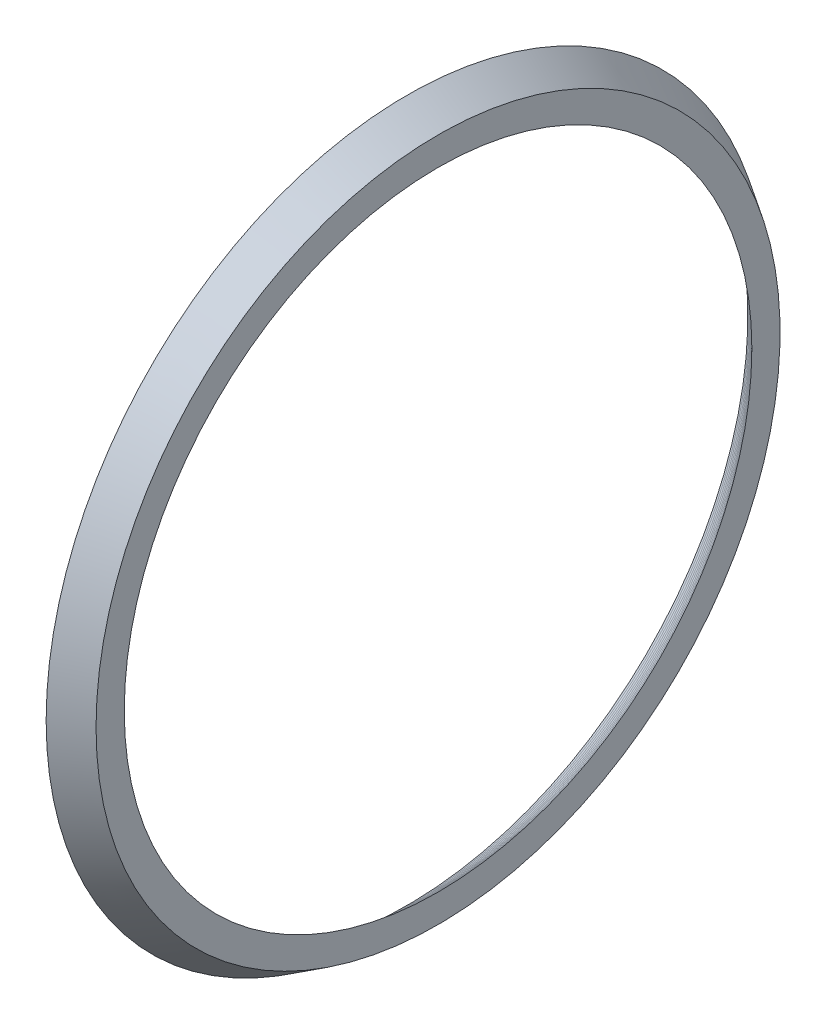
ISO-10303-21;
HEADER;
FILE_DESCRIPTION(('STEP AP214'),'2;1');
FILE_NAME('part.step','',(''),(''),'','','');
FILE_SCHEMA(('AUTOMOTIVE_DESIGN { 1 0 10303 214 1 1 1 1 }'));
ENDSEC;
DATA;
#1=APPLICATION_CONTEXT('core data for automotive mechanical design processes');
#2=APPLICATION_PROTOCOL_DEFINITION('international standard','automotive_design',2000,#1);
#3=PRODUCT_CONTEXT('',#1,'mechanical');
#4=PRODUCT('Part','Part','',(#3));
#5=PRODUCT_RELATED_PRODUCT_CATEGORY('part','',(#4));
#6=PRODUCT_DEFINITION_FORMATION('','',#4);
#7=PRODUCT_DEFINITION_CONTEXT('part definition',#1,'design');
#8=PRODUCT_DEFINITION('design','',#6,#7);
#9=PRODUCT_DEFINITION_SHAPE('','',#8);
#10=(LENGTH_UNIT() NAMED_UNIT(*) SI_UNIT(.MILLI.,.METRE.));
#11=(NAMED_UNIT(*) PLANE_ANGLE_UNIT() SI_UNIT($,.RADIAN.));
#12=(NAMED_UNIT(*) SI_UNIT($,.STERADIAN.) SOLID_ANGLE_UNIT());
#13=UNCERTAINTY_MEASURE_WITH_UNIT(LENGTH_MEASURE(1.E-05),#10,'distance_accuracy_value','');
#14=(GEOMETRIC_REPRESENTATION_CONTEXT(3) GLOBAL_UNCERTAINTY_ASSIGNED_CONTEXT((#13)) GLOBAL_UNIT_ASSIGNED_CONTEXT((#10,
#11,#12)) REPRESENTATION_CONTEXT('',''));
#15=CARTESIAN_POINT('',(0.,0.,0.));
#16=DIRECTION('',(0.,0.,1.));
#17=DIRECTION('',(1.,0.,0.));
#18=AXIS2_PLACEMENT_3D('',#15,#16,#17);
#19=CARTESIAN_POINT('',(3.175,70.5115,0.));
#20=DIRECTION('',(-1.,0.,0.));
#21=DIRECTION('',(0.,0.,1.));
#22=AXIS2_PLACEMENT_3D('',#19,#20,#21);
#23=PLANE('',#22);
#24=CARTESIAN_POINT('',(3.17499999999998,0.,0.));
#25=DIRECTION('',(-1.,0.,0.));
#26=DIRECTION('',(0.,0.,1.));
#27=AXIS2_PLACEMENT_3D('',#24,#25,#26);
#28=CIRCLE('',#27,70.5115);
#29=CARTESIAN_POINT('',(3.17499999999998,0.,70.5115));
#30=VERTEX_POINT('',#29);
#31=EDGE_CURVE('E10',#30,#30,#28,.T.);
#32=ORIENTED_EDGE('',*,*,#31,.F.);
#33=EDGE_LOOP('',(#32));
#34=FACE_BOUND('',#33,.T.);
#35=CARTESIAN_POINT('',(3.17499999999998,0.,0.));
#36=DIRECTION('',(-1.,0.,0.));
#37=DIRECTION('',(0.,0.,1.));
#38=AXIS2_PLACEMENT_3D('',#35,#36,#37);
#39=CIRCLE('',#38,64.6948926829307);
#40=CARTESIAN_POINT('',(3.17499999999998,0.,64.6948926829307));
#41=VERTEX_POINT('',#40);
#42=EDGE_CURVE('E77',#41,#41,#39,.T.);
#43=ORIENTED_EDGE('',*,*,#42,.T.);
#44=EDGE_LOOP('',(#43));
#45=FACE_BOUND('',#44,.T.);
#46=ADVANCED_FACE('F39',(#34,#45),#23,.F.);
#47=CARTESIAN_POINT('',(3.17499999999998,0.,0.));
#48=DIRECTION('',(-1.,0.,0.));
#49=DIRECTION('',(0.,0.,1.));
#50=AXIS2_PLACEMENT_3D('',#47,#48,#49);
#51=CONICAL_SURFACE('',#50,70.5115,0.55499572733859);
#52=CARTESIAN_POINT('',(-3.17499999999998,0.,0.));
#53=DIRECTION('',(-1.,0.,0.));
#54=DIRECTION('',(0.,0.,1.));
#55=AXIS2_PLACEMENT_3D('',#52,#53,#54);
#56=CIRCLE('',#55,74.4485);
#57=CARTESIAN_POINT('',(-3.17499999999998,0.,74.4485));
#58=VERTEX_POINT('',#57);
#59=EDGE_CURVE('E44',#58,#58,#56,.T.);
#60=ORIENTED_EDGE('',*,*,#59,.F.);
#61=EDGE_LOOP('',(#60));
#62=FACE_BOUND('',#61,.T.);
#63=ORIENTED_EDGE('',*,*,#31,.T.);
#64=EDGE_LOOP('',(#63));
#65=FACE_BOUND('',#64,.T.);
#66=ADVANCED_FACE('F132',(#62,#65),#51,.T.);
#67=CARTESIAN_POINT('',(-3.175,70.2326060841579,0.));
#68=DIRECTION('',(1.,0.,0.));
#69=DIRECTION('',(0.,0.,-1.));
#70=AXIS2_PLACEMENT_3D('',#67,#68,#69);
#71=PLANE('',#70);
#72=CARTESIAN_POINT('',(-3.17499999999998,0.,0.));
#73=DIRECTION('',(-1.,0.,0.));
#74=DIRECTION('',(0.,0.,1.));
#75=AXIS2_PLACEMENT_3D('',#72,#73,#74);
#76=CIRCLE('',#75,70.2326060841579);
#77=CARTESIAN_POINT('',(-3.17499999999998,0.,70.2326060841579));
#78=VERTEX_POINT('',#77);
#79=EDGE_CURVE('E47',#78,#78,#76,.T.);
#80=ORIENTED_EDGE('',*,*,#79,.F.);
#81=EDGE_LOOP('',(#80));
#82=FACE_BOUND('',#81,.T.);
#83=ORIENTED_EDGE('',*,*,#59,.T.);
#84=EDGE_LOOP('',(#83));
#85=FACE_BOUND('',#84,.T.);
#86=ADVANCED_FACE('F127',(#82,#85),#71,.F.);
#87=CARTESIAN_POINT('',(-3.17499999999998,0.,0.));
#88=DIRECTION('',(-1.,0.,0.));
#89=DIRECTION('',(0.,0.,1.));
#90=AXIS2_PLACEMENT_3D('',#87,#88,#89);
#91=CONICAL_SURFACE('',#90,70.2326060841579,0.640697177792621);
#92=CARTESIAN_POINT('',(-2.38125,0.,0.));
#93=DIRECTION('',(-1.,0.,0.));
#94=DIRECTION('',(0.,0.,1.));
#95=AXIS2_PLACEMENT_3D('',#92,#93,#94);
#96=CIRCLE('',#95,69.6407638271231);
#97=CARTESIAN_POINT('',(-2.38125,0.,69.6407638271231));
#98=VERTEX_POINT('',#97);
#99=EDGE_CURVE('E52',#98,#98,#96,.T.);
#100=ORIENTED_EDGE('',*,*,#99,.F.);
#101=EDGE_LOOP('',(#100));
#102=FACE_BOUND('',#101,.T.);
#103=ORIENTED_EDGE('',*,*,#79,.T.);
#104=EDGE_LOOP('',(#103));
#105=FACE_BOUND('',#104,.T.);
#106=ADVANCED_FACE('F118',(#102,#105),#91,.F.);
#107=CARTESIAN_POINT('',(-2.38125,0.,0.));
#108=DIRECTION('',(-1.,0.,0.));
#109=DIRECTION('',(0.,0.,1.));
#110=AXIS2_PLACEMENT_3D('',#107,#108,#109);
#111=CONICAL_SURFACE('',#110,69.6407638271231,0.662235364243934);
#112=CARTESIAN_POINT('',(-1.58750000000002,0.,0.));
#113=DIRECTION('',(-1.,0.,0.));
#114=DIRECTION('',(0.,0.,1.));
#115=AXIS2_PLACEMENT_3D('',#112,#113,#114);
#116=CIRCLE('',#115,69.0218825444318);
#117=CARTESIAN_POINT('',(-1.58750000000002,0.,69.0218825444318));
#118=VERTEX_POINT('',#117);
#119=EDGE_CURVE('E59',#118,#118,#116,.T.);
#120=ORIENTED_EDGE('',*,*,#119,.F.);
#121=EDGE_LOOP('',(#120));
#122=FACE_BOUND('',#121,.T.);
#123=ORIENTED_EDGE('',*,*,#99,.T.);
#124=EDGE_LOOP('',(#123));
#125=FACE_BOUND('',#124,.T.);
#126=ADVANCED_FACE('F111',(#122,#125),#111,.F.);
#127=CARTESIAN_POINT('',(-1.58750000000002,0.,0.));
#128=DIRECTION('',(-1.,0.,0.));
#129=DIRECTION('',(0.,0.,1.));
#130=AXIS2_PLACEMENT_3D('',#127,#128,#129);
#131=CONICAL_SURFACE('',#130,69.0218825444318,0.683630813781778);
#132=CARTESIAN_POINT('',(-0.793749999999982,0.,0.));
#133=DIRECTION('',(-1.,0.,0.));
#134=DIRECTION('',(0.,0.,1.));
#135=AXIS2_PLACEMENT_3D('',#132,#133,#134);
#136=CIRCLE('',#135,68.3752269537193);
#137=CARTESIAN_POINT('',(-0.793749999999982,0.,68.3752269537193));
#138=VERTEX_POINT('',#137);
#139=EDGE_CURVE('E62',#138,#138,#136,.T.);
#140=ORIENTED_EDGE('',*,*,#139,.F.);
#141=EDGE_LOOP('',(#140));
#142=FACE_BOUND('',#141,.T.);
#143=ORIENTED_EDGE('',*,*,#119,.T.);
#144=EDGE_LOOP('',(#143));
#145=FACE_BOUND('',#144,.T.);
#146=ADVANCED_FACE('F107',(#142,#145),#131,.F.);
#147=CARTESIAN_POINT('',(-0.793749999999982,0.,0.));
#148=DIRECTION('',(-1.,0.,0.));
#149=DIRECTION('',(0.,0.,1.));
#150=AXIS2_PLACEMENT_3D('',#147,#148,#149);
#151=CONICAL_SURFACE('',#150,68.3752269537193,0.704888490276885);
#152=CARTESIAN_POINT('',(0.,0.,0.));
#153=DIRECTION('',(-1.,0.,0.));
#154=DIRECTION('',(0.,0.,1.));
#155=AXIS2_PLACEMENT_3D('',#152,#153,#154);
#156=CIRCLE('',#155,67.7);
#157=CARTESIAN_POINT('',(0.,0.,67.7));
#158=VERTEX_POINT('',#157);
#159=EDGE_CURVE('E61',#158,#158,#156,.T.);
#160=ORIENTED_EDGE('',*,*,#159,.F.);
#161=EDGE_LOOP('',(#160));
#162=FACE_BOUND('',#161,.T.);
#163=ORIENTED_EDGE('',*,*,#139,.T.);
#164=EDGE_LOOP('',(#163));
#165=FACE_BOUND('',#164,.T.);
#166=ADVANCED_FACE('F105',(#162,#165),#151,.F.);
#167=CARTESIAN_POINT('',(0.,0.,0.));
#168=DIRECTION('',(-1.,0.,0.));
#169=DIRECTION('',(0.,0.,1.));
#170=AXIS2_PLACEMENT_3D('',#167,#168,#169);
#171=CONICAL_SURFACE('',#170,67.7,0.726014177916849);
#172=CARTESIAN_POINT('',(0.793749999999982,0.,0.));
#173=DIRECTION('',(-1.,0.,0.));
#174=DIRECTION('',(0.,0.,1.));
#175=AXIS2_PLACEMENT_3D('',#172,#173,#174);
#176=CIRCLE('',#175,66.9953365095266);
#177=CARTESIAN_POINT('',(0.793749999999982,0.,66.9953365095266));
#178=VERTEX_POINT('',#177);
#179=EDGE_CURVE('E70',#178,#178,#176,.T.);
#180=ORIENTED_EDGE('',*,*,#179,.F.);
#181=EDGE_LOOP('',(#180));
#182=FACE_BOUND('',#181,.T.);
#183=ORIENTED_EDGE('',*,*,#159,.T.);
#184=EDGE_LOOP('',(#183));
#185=FACE_BOUND('',#184,.T.);
#186=ADVANCED_FACE('F96',(#182,#185),#171,.F.);
#187=CARTESIAN_POINT('',(0.793749999999982,0.,0.));
#188=DIRECTION('',(-1.,0.,0.));
#189=DIRECTION('',(0.,0.,1.));
#190=AXIS2_PLACEMENT_3D('',#187,#188,#189);
#191=CONICAL_SURFACE('',#190,66.9953365095266,0.747014507680614);
#192=CARTESIAN_POINT('',(1.58750000000002,0.,0.));
#193=DIRECTION('',(-1.,0.,0.));
#194=DIRECTION('',(0.,0.,1.));
#195=AXIS2_PLACEMENT_3D('',#192,#193,#194);
#196=CIRCLE('',#195,66.2602959164353);
#197=CARTESIAN_POINT('',(1.58750000000002,0.,66.2602959164353));
#198=VERTEX_POINT('',#197);
#199=EDGE_CURVE('E69',#198,#198,#196,.T.);
#200=ORIENTED_EDGE('',*,*,#199,.F.);
#201=EDGE_LOOP('',(#200));
#202=FACE_BOUND('',#201,.T.);
#203=ORIENTED_EDGE('',*,*,#179,.T.);
#204=EDGE_LOOP('',(#203));
#205=FACE_BOUND('',#204,.T.);
#206=ADVANCED_FACE('F89',(#202,#205),#191,.F.);
#207=CARTESIAN_POINT('',(1.58750000000002,0.,0.));
#208=DIRECTION('',(-1.,0.,0.));
#209=DIRECTION('',(0.,0.,1.));
#210=AXIS2_PLACEMENT_3D('',#207,#208,#209);
#211=CONICAL_SURFACE('',#210,66.2602959164353,0.767896991208727);
#212=CARTESIAN_POINT('',(2.38125,0.,0.));
#213=DIRECTION('',(-1.,0.,0.));
#214=DIRECTION('',(0.,0.,1.));
#215=AXIS2_PLACEMENT_3D('',#212,#213,#214);
#216=CIRCLE('',#215,65.4938538937909);
#217=CARTESIAN_POINT('',(2.38125,0.,65.4938538937909));
#218=VERTEX_POINT('',#217);
#219=EDGE_CURVE('E71',#218,#218,#216,.T.);
#220=ORIENTED_EDGE('',*,*,#219,.F.);
#221=EDGE_LOOP('',(#220));
#222=FACE_BOUND('',#221,.T.);
#223=ORIENTED_EDGE('',*,*,#199,.T.);
#224=EDGE_LOOP('',(#223));
#225=FACE_BOUND('',#224,.T.);
#226=ADVANCED_FACE('F83',(#222,#225),#211,.F.);
#227=CARTESIAN_POINT('',(2.38125,0.,0.));
#228=DIRECTION('',(-1.,0.,0.));
#229=DIRECTION('',(0.,0.,1.));
#230=AXIS2_PLACEMENT_3D('',#227,#228,#229);
#231=CONICAL_SURFACE('',#230,65.4938538937909,0.788670063682146);
#232=ORIENTED_EDGE('',*,*,#42,.F.);
#233=EDGE_LOOP('',(#232));
#234=FACE_BOUND('',#233,.T.);
#235=ORIENTED_EDGE('',*,*,#219,.T.);
#236=EDGE_LOOP('',(#235));
#237=FACE_BOUND('',#236,.T.);
#238=ADVANCED_FACE('F81',(#234,#237),#231,.F.);
#239=CLOSED_SHELL('',(#46,#66,#86,#106,#126,#146,#166,#186,#206,#226,#238));
#240=MANIFOLD_SOLID_BREP('B2',#239);
#241=ADVANCED_BREP_SHAPE_REPRESENTATION('',(#18,#240),#14);
#242=SHAPE_DEFINITION_REPRESENTATION(#9,#241);
ENDSEC;
END-ISO-10303-21;
